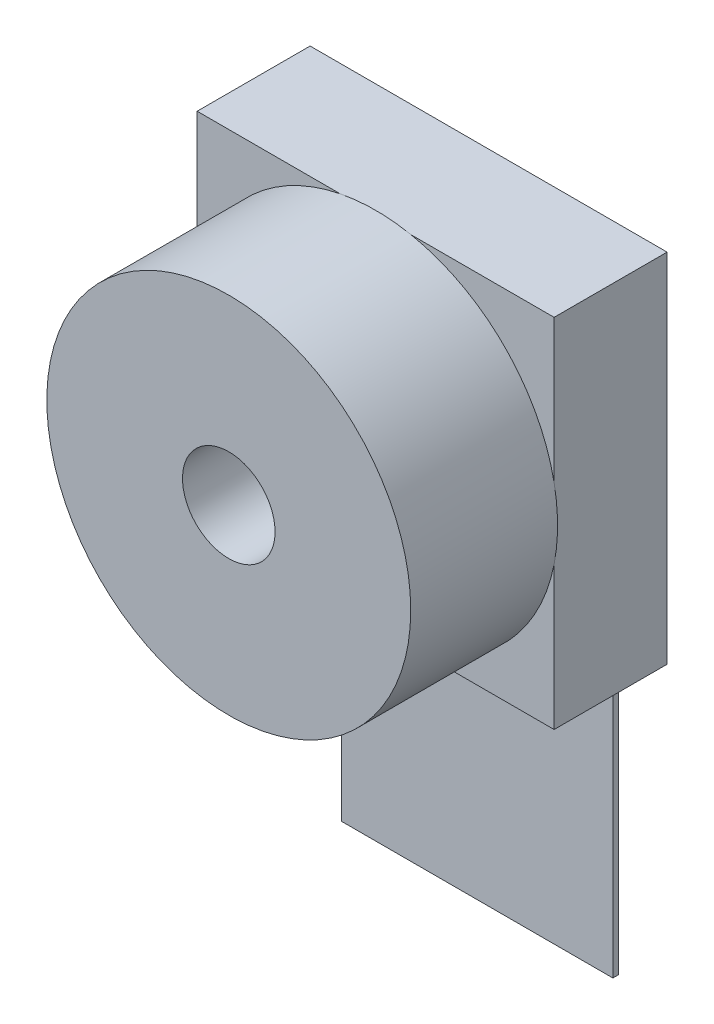
ISO-10303-21;
HEADER;
FILE_DESCRIPTION(('STEP AP214'),'2;1');
FILE_NAME('part.step','',(''),(''),'','','');
FILE_SCHEMA(('AUTOMOTIVE_DESIGN { 1 0 10303 214 1 1 1 1 }'));
ENDSEC;
DATA;
#1=APPLICATION_CONTEXT('core data for automotive mechanical design processes');
#2=APPLICATION_PROTOCOL_DEFINITION('international standard','automotive_design',2000,#1);
#3=PRODUCT_CONTEXT('',#1,'mechanical');
#4=PRODUCT('Part','Part','',(#3));
#5=PRODUCT_RELATED_PRODUCT_CATEGORY('part','',(#4));
#6=PRODUCT_DEFINITION_FORMATION('','',#4);
#7=PRODUCT_DEFINITION_CONTEXT('part definition',#1,'design');
#8=PRODUCT_DEFINITION('design','',#6,#7);
#9=PRODUCT_DEFINITION_SHAPE('','',#8);
#10=(LENGTH_UNIT() NAMED_UNIT(*) SI_UNIT(.MILLI.,.METRE.));
#11=(NAMED_UNIT(*) PLANE_ANGLE_UNIT() SI_UNIT($,.RADIAN.));
#12=(NAMED_UNIT(*) SI_UNIT($,.STERADIAN.) SOLID_ANGLE_UNIT());
#13=UNCERTAINTY_MEASURE_WITH_UNIT(LENGTH_MEASURE(1.E-05),#10,'distance_accuracy_value','');
#14=(GEOMETRIC_REPRESENTATION_CONTEXT(3) GLOBAL_UNCERTAINTY_ASSIGNED_CONTEXT((#13)) GLOBAL_UNIT_ASSIGNED_CONTEXT((#10,
#11,#12)) REPRESENTATION_CONTEXT('',''));
#15=CARTESIAN_POINT('',(0.,0.,0.));
#16=DIRECTION('',(0.,0.,1.));
#17=DIRECTION('',(1.,0.,0.));
#18=AXIS2_PLACEMENT_3D('',#15,#16,#17);
#19=CARTESIAN_POINT('',(3.048,3.048,-0.127));
#20=DIRECTION('',(-1.,0.,0.));
#21=DIRECTION('',(0.,0.,1.));
#22=AXIS2_PLACEMENT_3D('',#19,#20,#21);
#23=PLANE('',#22);
#24=DIRECTION('',(0.,0.,-1.));
#25=VECTOR('',#24,1.);
#26=CARTESIAN_POINT('',(3.048,-4.0132,-0.127));
#27=LINE('',#26,#25);
#28=CARTESIAN_POINT('',(3.048,-4.0132,0.));
#29=VERTEX_POINT('',#28);
#30=CARTESIAN_POINT('',(3.048,-4.0132,-0.127));
#31=VERTEX_POINT('',#30);
#32=EDGE_CURVE('E50',#29,#31,#27,.T.);
#33=ORIENTED_EDGE('',*,*,#32,.F.);
#34=DIRECTION('',(0.,-1.,0.));
#35=VECTOR('',#34,1.);
#36=CARTESIAN_POINT('',(3.048,3.048,0.));
#37=LINE('',#36,#35);
#38=CARTESIAN_POINT('',(3.048,-10.4775,0.));
#39=VERTEX_POINT('',#38);
#40=EDGE_CURVE('E159',#29,#39,#37,.T.);
#41=ORIENTED_EDGE('',*,*,#40,.T.);
#42=DIRECTION('',(0.,0.,1.));
#43=VECTOR('',#42,1.);
#44=CARTESIAN_POINT('',(3.048,-10.4775,-0.127));
#45=LINE('',#44,#43);
#46=CARTESIAN_POINT('',(3.048,-10.4775,-0.127));
#47=VERTEX_POINT('',#46);
#48=EDGE_CURVE('E176',#47,#39,#45,.T.);
#49=ORIENTED_EDGE('',*,*,#48,.F.);
#50=DIRECTION('',(0.,-1.,0.));
#51=VECTOR('',#50,1.);
#52=CARTESIAN_POINT('',(3.048,3.048,-0.127));
#53=LINE('',#52,#51);
#54=EDGE_CURVE('E160',#31,#47,#53,.T.);
#55=ORIENTED_EDGE('',*,*,#54,.F.);
#56=EDGE_LOOP('',(#33,#41,#49,#55));
#57=FACE_BOUND('',#56,.T.);
#58=ADVANCED_FACE('F32',(#57),#23,.F.);
#59=CARTESIAN_POINT('',(-3.048,3.048,-0.127));
#60=DIRECTION('',(1.,0.,0.));
#61=DIRECTION('',(0.,1.,0.));
#62=AXIS2_PLACEMENT_3D('',#59,#60,#61);
#63=PLANE('',#62);
#64=DIRECTION('',(0.,0.,1.));
#65=VECTOR('',#64,1.);
#66=CARTESIAN_POINT('',(-3.048,-4.0132,-0.127));
#67=LINE('',#66,#65);
#68=CARTESIAN_POINT('',(-3.048,-4.0132,-0.127));
#69=VERTEX_POINT('',#68);
#70=CARTESIAN_POINT('',(-3.048,-4.0132,0.));
#71=VERTEX_POINT('',#70);
#72=EDGE_CURVE('E156',#69,#71,#67,.T.);
#73=ORIENTED_EDGE('',*,*,#72,.F.);
#74=DIRECTION('',(0.,1.,0.));
#75=VECTOR('',#74,1.);
#76=CARTESIAN_POINT('',(-3.048,3.048,-0.127));
#77=LINE('',#76,#75);
#78=CARTESIAN_POINT('',(-3.048,-10.4775,-0.127));
#79=VERTEX_POINT('',#78);
#80=EDGE_CURVE('E165',#79,#69,#77,.T.);
#81=ORIENTED_EDGE('',*,*,#80,.F.);
#82=DIRECTION('',(0.,0.,1.));
#83=VECTOR('',#82,1.);
#84=CARTESIAN_POINT('',(-3.048,-10.4775,-0.127));
#85=LINE('',#84,#83);
#86=CARTESIAN_POINT('',(-3.048,-10.4775,0.));
#87=VERTEX_POINT('',#86);
#88=EDGE_CURVE('E168',#79,#87,#85,.T.);
#89=ORIENTED_EDGE('',*,*,#88,.T.);
#90=DIRECTION('',(0.,1.,0.));
#91=VECTOR('',#90,1.);
#92=CARTESIAN_POINT('',(-3.048,3.048,0.));
#93=LINE('',#92,#91);
#94=EDGE_CURVE('E163',#87,#71,#93,.T.);
#95=ORIENTED_EDGE('',*,*,#94,.T.);
#96=EDGE_LOOP('',(#73,#81,#89,#95));
#97=FACE_BOUND('',#96,.T.);
#98=ADVANCED_FACE('F262',(#97),#63,.F.);
#99=CARTESIAN_POINT('',(0.,0.,-0.127));
#100=DIRECTION('',(0.,0.,-1.));
#101=DIRECTION('',(-1.,0.,0.));
#102=AXIS2_PLACEMENT_3D('',#99,#100,#101);
#103=PLANE('',#102);
#104=ORIENTED_EDGE('',*,*,#80,.T.);
#105=DIRECTION('',(1.,0.,0.));
#106=VECTOR('',#105,1.);
#107=CARTESIAN_POINT('',(0.,-4.0132,-0.127));
#108=LINE('',#107,#106);
#109=EDGE_CURVE('E154',#69,#31,#108,.T.);
#110=ORIENTED_EDGE('',*,*,#109,.T.);
#111=ORIENTED_EDGE('',*,*,#54,.T.);
#112=DIRECTION('',(-1.,0.,0.));
#113=VECTOR('',#112,1.);
#114=CARTESIAN_POINT('',(3.048,-10.4775,-0.127));
#115=LINE('',#114,#113);
#116=EDGE_CURVE('E162',#47,#79,#115,.T.);
#117=ORIENTED_EDGE('',*,*,#116,.T.);
#118=EDGE_LOOP('',(#104,#110,#111,#117));
#119=FACE_BOUND('',#118,.T.);
#120=ADVANCED_FACE('F268',(#119),#103,.T.);
#121=CARTESIAN_POINT('',(0.,0.,2.286));
#122=DIRECTION('',(0.,0.,-1.));
#123=DIRECTION('',(-1.,0.,0.));
#124=AXIS2_PLACEMENT_3D('',#121,#122,#123);
#125=PLANE('',#124);
#126=CARTESIAN_POINT('',(0.,0.,2.286));
#127=DIRECTION('',(0.,0.,1.));
#128=DIRECTION('',(1.,0.,0.));
#129=AXIS2_PLACEMENT_3D('',#126,#127,#128);
#130=CIRCLE('',#129,4.09125435365183);
#131=CARTESIAN_POINT('',(4.0132,0.795353975456874,2.286));
#132=VERTEX_POINT('',#131);
#133=CARTESIAN_POINT('',(0.795353975456869,4.0132,2.286));
#134=VERTEX_POINT('',#133);
#135=EDGE_CURVE('E189',#132,#134,#130,.T.);
#136=ORIENTED_EDGE('',*,*,#135,.F.);
#137=DIRECTION('',(0.,1.,0.));
#138=VECTOR('',#137,1.);
#139=CARTESIAN_POINT('',(4.0132,-4.0132,2.286));
#140=LINE('',#139,#138);
#141=CARTESIAN_POINT('',(4.0132,4.0132,2.286));
#142=VERTEX_POINT('',#141);
#143=EDGE_CURVE('E195',#132,#142,#140,.T.);
#144=ORIENTED_EDGE('',*,*,#143,.T.);
#145=DIRECTION('',(-1.,0.,0.));
#146=VECTOR('',#145,1.);
#147=CARTESIAN_POINT('',(-4.0132,4.0132,2.286));
#148=LINE('',#147,#146);
#149=EDGE_CURVE('E196',#142,#134,#148,.T.);
#150=ORIENTED_EDGE('',*,*,#149,.T.);
#151=EDGE_LOOP('',(#136,#144,#150));
#152=FACE_BOUND('',#151,.T.);
#153=ADVANCED_FACE('F245',(#152),#125,.F.);
#154=CARTESIAN_POINT('',(-0.795353975456869,4.0132,2.286));
#155=VERTEX_POINT('',#154);
#156=CARTESIAN_POINT('',(-4.0132,0.795353975456869,2.286));
#157=VERTEX_POINT('',#156);
#158=EDGE_CURVE('E11',#155,#157,#130,.T.);
#159=ORIENTED_EDGE('',*,*,#158,.F.);
#160=CARTESIAN_POINT('',(-4.0132,4.0132,2.286));
#161=VERTEX_POINT('',#160);
#162=EDGE_CURVE('E193',#155,#161,#148,.T.);
#163=ORIENTED_EDGE('',*,*,#162,.T.);
#164=DIRECTION('',(0.,-1.,0.));
#165=VECTOR('',#164,1.);
#166=CARTESIAN_POINT('',(-4.0132,-4.0132,2.286));
#167=LINE('',#166,#165);
#168=EDGE_CURVE('E201',#161,#157,#167,.T.);
#169=ORIENTED_EDGE('',*,*,#168,.T.);
#170=EDGE_LOOP('',(#159,#163,#169));
#171=FACE_BOUND('',#170,.T.);
#172=ADVANCED_FACE('F237',(#171),#125,.F.);
#173=CARTESIAN_POINT('',(-4.0132,-0.795353975456869,2.286));
#174=VERTEX_POINT('',#173);
#175=CARTESIAN_POINT('',(-0.795353975456869,-4.0132,2.286));
#176=VERTEX_POINT('',#175);
#177=EDGE_CURVE('E41',#174,#176,#130,.T.);
#178=ORIENTED_EDGE('',*,*,#177,.F.);
#179=CARTESIAN_POINT('',(-4.0132,-4.0132,2.286));
#180=VERTEX_POINT('',#179);
#181=EDGE_CURVE('E199',#174,#180,#167,.T.);
#182=ORIENTED_EDGE('',*,*,#181,.T.);
#183=DIRECTION('',(1.,0.,0.));
#184=VECTOR('',#183,1.);
#185=CARTESIAN_POINT('',(-4.0132,-4.0132,2.286));
#186=LINE('',#185,#184);
#187=EDGE_CURVE('E134',#180,#176,#186,.T.);
#188=ORIENTED_EDGE('',*,*,#187,.T.);
#189=EDGE_LOOP('',(#178,#182,#188));
#190=FACE_BOUND('',#189,.T.);
#191=ADVANCED_FACE('F228',(#190),#125,.F.);
#192=CARTESIAN_POINT('',(0.795353975456869,-4.0132,2.286));
#193=VERTEX_POINT('',#192);
#194=CARTESIAN_POINT('',(4.0132,-0.795353975456874,2.286));
#195=VERTEX_POINT('',#194);
#196=EDGE_CURVE('E58',#193,#195,#130,.T.);
#197=ORIENTED_EDGE('',*,*,#196,.F.);
#198=CARTESIAN_POINT('',(4.0132,-4.0132,2.286));
#199=VERTEX_POINT('',#198);
#200=EDGE_CURVE('E204',#193,#199,#186,.T.);
#201=ORIENTED_EDGE('',*,*,#200,.T.);
#202=EDGE_CURVE('E131',#199,#195,#140,.T.);
#203=ORIENTED_EDGE('',*,*,#202,.T.);
#204=EDGE_LOOP('',(#197,#201,#203));
#205=FACE_BOUND('',#204,.T.);
#206=ADVANCED_FACE('F296',(#205),#125,.F.);
#207=CARTESIAN_POINT('',(4.0132,-4.0132,2.286));
#208=DIRECTION('',(-1.,0.,0.));
#209=DIRECTION('',(0.,0.,1.));
#210=AXIS2_PLACEMENT_3D('',#207,#208,#209);
#211=PLANE('',#210);
#212=DIRECTION('',(0.,0.,-1.));
#213=VECTOR('',#212,1.);
#214=CARTESIAN_POINT('',(4.0132,-4.0132,2.286));
#215=LINE('',#214,#213);
#216=CARTESIAN_POINT('',(4.0132,-4.0132,-0.254));
#217=VERTEX_POINT('',#216);
#218=EDGE_CURVE('E125',#199,#217,#215,.T.);
#219=ORIENTED_EDGE('',*,*,#218,.T.);
#220=DIRECTION('',(0.,-1.,0.));
#221=VECTOR('',#220,1.);
#222=CARTESIAN_POINT('',(4.0132,4.0132,-0.254));
#223=LINE('',#222,#221);
#224=CARTESIAN_POINT('',(4.0132,4.0132,-0.254));
#225=VERTEX_POINT('',#224);
#226=EDGE_CURVE('E129',#225,#217,#223,.T.);
#227=ORIENTED_EDGE('',*,*,#226,.F.);
#228=DIRECTION('',(0.,0.,-1.));
#229=VECTOR('',#228,1.);
#230=CARTESIAN_POINT('',(4.0132,4.0132,2.286));
#231=LINE('',#230,#229);
#232=EDGE_CURVE('E36',#142,#225,#231,.T.);
#233=ORIENTED_EDGE('',*,*,#232,.F.);
#234=ORIENTED_EDGE('',*,*,#143,.F.);
#235=EDGE_CURVE('E194',#195,#132,#140,.T.);
#236=ORIENTED_EDGE('',*,*,#235,.F.);
#237=ORIENTED_EDGE('',*,*,#202,.F.);
#238=EDGE_LOOP('',(#219,#227,#233,#234,#236,#237));
#239=FACE_BOUND('',#238,.T.);
#240=ADVANCED_FACE('F34',(#239),#211,.F.);
#241=CARTESIAN_POINT('',(-4.0132,4.0132,2.286));
#242=DIRECTION('',(0.,-1.,0.));
#243=DIRECTION('',(0.,0.,-1.));
#244=AXIS2_PLACEMENT_3D('',#241,#242,#243);
#245=PLANE('',#244);
#246=ORIENTED_EDGE('',*,*,#232,.T.);
#247=DIRECTION('',(1.,0.,0.));
#248=VECTOR('',#247,1.);
#249=CARTESIAN_POINT('',(4.0132,4.0132,-0.254));
#250=LINE('',#249,#248);
#251=CARTESIAN_POINT('',(-4.0132,4.0132,-0.254));
#252=VERTEX_POINT('',#251);
#253=EDGE_CURVE('E149',#252,#225,#250,.T.);
#254=ORIENTED_EDGE('',*,*,#253,.F.);
#255=DIRECTION('',(0.,0.,-1.));
#256=VECTOR('',#255,1.);
#257=CARTESIAN_POINT('',(-4.0132,4.0132,2.286));
#258=LINE('',#257,#256);
#259=EDGE_CURVE('E210',#161,#252,#258,.T.);
#260=ORIENTED_EDGE('',*,*,#259,.F.);
#261=ORIENTED_EDGE('',*,*,#162,.F.);
#262=EDGE_CURVE('E200',#134,#155,#148,.T.);
#263=ORIENTED_EDGE('',*,*,#262,.F.);
#264=ORIENTED_EDGE('',*,*,#149,.F.);
#265=EDGE_LOOP('',(#246,#254,#260,#261,#263,#264));
#266=FACE_BOUND('',#265,.T.);
#267=ADVANCED_FACE('F239',(#266),#245,.F.);
#268=CARTESIAN_POINT('',(-4.0132,-4.0132,2.286));
#269=DIRECTION('',(1.,0.,0.));
#270=DIRECTION('',(0.,0.,-1.));
#271=AXIS2_PLACEMENT_3D('',#268,#269,#270);
#272=PLANE('',#271);
#273=ORIENTED_EDGE('',*,*,#259,.T.);
#274=DIRECTION('',(0.,1.,0.));
#275=VECTOR('',#274,1.);
#276=CARTESIAN_POINT('',(-4.0132,4.0132,-0.254));
#277=LINE('',#276,#275);
#278=CARTESIAN_POINT('',(-4.0132,-4.0132,-0.254));
#279=VERTEX_POINT('',#278);
#280=EDGE_CURVE('E144',#279,#252,#277,.T.);
#281=ORIENTED_EDGE('',*,*,#280,.F.);
#282=DIRECTION('',(0.,0.,-1.));
#283=VECTOR('',#282,1.);
#284=CARTESIAN_POINT('',(-4.0132,-4.0132,2.286));
#285=LINE('',#284,#283);
#286=EDGE_CURVE('E133',#180,#279,#285,.T.);
#287=ORIENTED_EDGE('',*,*,#286,.F.);
#288=ORIENTED_EDGE('',*,*,#181,.F.);
#289=EDGE_CURVE('E205',#157,#174,#167,.T.);
#290=ORIENTED_EDGE('',*,*,#289,.F.);
#291=ORIENTED_EDGE('',*,*,#168,.F.);
#292=EDGE_LOOP('',(#273,#281,#287,#288,#290,#291));
#293=FACE_BOUND('',#292,.T.);
#294=ADVANCED_FACE('F230',(#293),#272,.F.);
#295=CARTESIAN_POINT('',(-4.0132,-4.0132,2.286));
#296=DIRECTION('',(0.,1.,0.));
#297=DIRECTION('',(0.,0.,1.));
#298=AXIS2_PLACEMENT_3D('',#295,#296,#297);
#299=PLANE('',#298);
#300=ORIENTED_EDGE('',*,*,#72,.T.);
#301=DIRECTION('',(1.,0.,0.));
#302=VECTOR('',#301,1.);
#303=CARTESIAN_POINT('',(-4.0132,-4.0132,0.));
#304=LINE('',#303,#302);
#305=EDGE_CURVE('E188',#71,#29,#304,.T.);
#306=ORIENTED_EDGE('',*,*,#305,.T.);
#307=ORIENTED_EDGE('',*,*,#32,.T.);
#308=ORIENTED_EDGE('',*,*,#109,.F.);
#309=EDGE_LOOP('',(#300,#306,#307,#308));
#310=FACE_BOUND('',#309,.T.);
#311=ORIENTED_EDGE('',*,*,#286,.T.);
#312=DIRECTION('',(-1.,0.,0.));
#313=VECTOR('',#312,1.);
#314=CARTESIAN_POINT('',(4.0132,-4.0132,-0.254));
#315=LINE('',#314,#313);
#316=EDGE_CURVE('E137',#217,#279,#315,.T.);
#317=ORIENTED_EDGE('',*,*,#316,.F.);
#318=ORIENTED_EDGE('',*,*,#218,.F.);
#319=ORIENTED_EDGE('',*,*,#200,.F.);
#320=EDGE_CURVE('E208',#176,#193,#186,.T.);
#321=ORIENTED_EDGE('',*,*,#320,.F.);
#322=ORIENTED_EDGE('',*,*,#187,.F.);
#323=EDGE_LOOP('',(#311,#317,#318,#319,#321,#322));
#324=FACE_BOUND('',#323,.T.);
#325=ADVANCED_FACE('F138',(#310,#324),#299,.F.);
#326=CARTESIAN_POINT('',(0.,0.,2.286));
#327=DIRECTION('',(0.,0.,1.));
#328=DIRECTION('',(1.,0.,0.));
#329=AXIS2_PLACEMENT_3D('',#326,#327,#328);
#330=PLANE('',#329);
#331=EDGE_CURVE('E183',#195,#132,#130,.T.);
#332=ORIENTED_EDGE('',*,*,#331,.F.);
#333=ORIENTED_EDGE('',*,*,#235,.T.);
#334=EDGE_LOOP('',(#332,#333));
#335=FACE_BOUND('',#334,.T.);
#336=ADVANCED_FACE('F248',(#335),#330,.F.);
#337=EDGE_CURVE('E43',#134,#155,#130,.T.);
#338=ORIENTED_EDGE('',*,*,#337,.F.);
#339=ORIENTED_EDGE('',*,*,#262,.T.);
#340=EDGE_LOOP('',(#338,#339));
#341=FACE_BOUND('',#340,.T.);
#342=ADVANCED_FACE('F241',(#341),#330,.F.);
#343=EDGE_CURVE('E225',#157,#174,#130,.T.);
#344=ORIENTED_EDGE('',*,*,#343,.F.);
#345=ORIENTED_EDGE('',*,*,#289,.T.);
#346=EDGE_LOOP('',(#344,#345));
#347=FACE_BOUND('',#346,.T.);
#348=ADVANCED_FACE('F232',(#347),#330,.F.);
#349=EDGE_CURVE('E223',#176,#193,#130,.T.);
#350=ORIENTED_EDGE('',*,*,#349,.F.);
#351=ORIENTED_EDGE('',*,*,#320,.T.);
#352=EDGE_LOOP('',(#350,#351));
#353=FACE_BOUND('',#352,.T.);
#354=ADVANCED_FACE('F251',(#353),#330,.F.);
#355=CARTESIAN_POINT('',(0.,0.,5.588));
#356=DIRECTION('',(0.,0.,-1.));
#357=DIRECTION('',(-1.,0.,0.));
#358=AXIS2_PLACEMENT_3D('',#355,#356,#357);
#359=CYLINDRICAL_SURFACE('',#358,4.09125435365183);
#360=CARTESIAN_POINT('',(0.,0.,5.588));
#361=DIRECTION('',(0.,0.,1.));
#362=DIRECTION('',(1.,0.,0.));
#363=AXIS2_PLACEMENT_3D('',#360,#361,#362);
#364=CIRCLE('',#363,4.09125435365183);
#365=CARTESIAN_POINT('',(4.09125435365183,0.,5.588));
#366=VERTEX_POINT('',#365);
#367=EDGE_CURVE('E186',#366,#366,#364,.T.);
#368=ORIENTED_EDGE('',*,*,#367,.F.);
#369=EDGE_LOOP('',(#368));
#370=FACE_BOUND('',#369,.T.);
#371=ORIENTED_EDGE('',*,*,#135,.T.);
#372=ORIENTED_EDGE('',*,*,#337,.T.);
#373=ORIENTED_EDGE('',*,*,#158,.T.);
#374=ORIENTED_EDGE('',*,*,#343,.T.);
#375=ORIENTED_EDGE('',*,*,#177,.T.);
#376=ORIENTED_EDGE('',*,*,#349,.T.);
#377=ORIENTED_EDGE('',*,*,#196,.T.);
#378=ORIENTED_EDGE('',*,*,#331,.T.);
#379=EDGE_LOOP('',(#371,#372,#373,#374,#375,#376,#377,#378));
#380=FACE_BOUND('',#379,.T.);
#381=ADVANCED_FACE('F221',(#370,#380),#359,.T.);
#382=CARTESIAN_POINT('',(0.,0.,5.588));
#383=DIRECTION('',(0.,0.,1.));
#384=DIRECTION('',(1.,0.,0.));
#385=AXIS2_PLACEMENT_3D('',#382,#383,#384);
#386=PLANE('',#385);
#387=CARTESIAN_POINT('',(0.,0.,5.588));
#388=DIRECTION('',(0.,0.,1.));
#389=DIRECTION('',(1.,0.,0.));
#390=AXIS2_PLACEMENT_3D('',#387,#388,#389);
#391=CIRCLE('',#390,1.04049465097927);
#392=CARTESIAN_POINT('',(1.04049465097927,0.,5.588));
#393=VERTEX_POINT('',#392);
#394=EDGE_CURVE('E179',#393,#393,#391,.T.);
#395=ORIENTED_EDGE('',*,*,#394,.F.);
#396=EDGE_LOOP('',(#395));
#397=FACE_BOUND('',#396,.T.);
#398=ORIENTED_EDGE('',*,*,#367,.T.);
#399=EDGE_LOOP('',(#398));
#400=FACE_BOUND('',#399,.T.);
#401=ADVANCED_FACE('F280',(#397,#400),#386,.T.);
#402=CARTESIAN_POINT('',(0.,0.,2.286));
#403=DIRECTION('',(0.,0.,1.));
#404=DIRECTION('',(1.,0.,0.));
#405=AXIS2_PLACEMENT_3D('',#402,#403,#404);
#406=CYLINDRICAL_SURFACE('',#405,1.04049465097927);
#407=CARTESIAN_POINT('',(0.,0.,2.286));
#408=DIRECTION('',(0.,0.,1.));
#409=DIRECTION('',(1.,0.,0.));
#410=AXIS2_PLACEMENT_3D('',#407,#408,#409);
#411=CIRCLE('',#410,1.04049465097927);
#412=CARTESIAN_POINT('',(1.04049465097927,0.,2.286));
#413=VERTEX_POINT('',#412);
#414=EDGE_CURVE('E180',#413,#413,#411,.T.);
#415=CARTESIAN_POINT('',(1.04049465097927,0.,2.286));
#416=CARTESIAN_POINT('',(1.04049465097927,0.,2.32039583333333));
#417=CARTESIAN_POINT('',(1.04049465097927,0.,2.35479166666667));
#418=CARTESIAN_POINT('',(1.04049465097927,0.,2.42358333333333));
#419=CARTESIAN_POINT('',(1.04049465097927,0.,2.45797916666667));
#420=CARTESIAN_POINT('',(1.04049465097927,0.,2.52677083333333));
#421=CARTESIAN_POINT('',(1.04049465097927,0.,2.56116666666667));
#422=CARTESIAN_POINT('',(1.04049465097927,0.,2.62995833333333));
#423=CARTESIAN_POINT('',(1.04049465097927,0.,2.66435416666667));
#424=CARTESIAN_POINT('',(1.04049465097927,0.,2.73314583333333));
#425=CARTESIAN_POINT('',(1.04049465097927,0.,2.76754166666667));
#426=CARTESIAN_POINT('',(1.04049465097927,0.,2.83633333333333));
#427=CARTESIAN_POINT('',(1.04049465097927,0.,2.87072916666667));
#428=CARTESIAN_POINT('',(1.04049465097927,0.,2.93952083333333));
#429=CARTESIAN_POINT('',(1.04049465097927,0.,2.97391666666667));
#430=CARTESIAN_POINT('',(1.04049465097927,0.,3.04270833333333));
#431=CARTESIAN_POINT('',(1.04049465097927,0.,3.07710416666667));
#432=CARTESIAN_POINT('',(1.04049465097927,0.,3.14589583333333));
#433=CARTESIAN_POINT('',(1.04049465097927,0.,3.18029166666667));
#434=CARTESIAN_POINT('',(1.04049465097927,0.,3.24908333333333));
#435=CARTESIAN_POINT('',(1.04049465097927,0.,3.28347916666667));
#436=CARTESIAN_POINT('',(1.04049465097927,0.,3.35227083333333));
#437=CARTESIAN_POINT('',(1.04049465097927,0.,3.38666666666667));
#438=CARTESIAN_POINT('',(1.04049465097927,0.,3.45545833333333));
#439=CARTESIAN_POINT('',(1.04049465097927,0.,3.48985416666667));
#440=CARTESIAN_POINT('',(1.04049465097927,0.,3.55864583333333));
#441=CARTESIAN_POINT('',(1.04049465097927,0.,3.59304166666667));
#442=CARTESIAN_POINT('',(1.04049465097927,0.,3.66183333333333));
#443=CARTESIAN_POINT('',(1.04049465097927,0.,3.69622916666667));
#444=CARTESIAN_POINT('',(1.04049465097927,0.,3.76502083333333));
#445=CARTESIAN_POINT('',(1.04049465097927,0.,3.79941666666667));
#446=CARTESIAN_POINT('',(1.04049465097927,0.,3.86820833333333));
#447=CARTESIAN_POINT('',(1.04049465097927,0.,3.90260416666667));
#448=CARTESIAN_POINT('',(1.04049465097927,0.,3.97139583333333));
#449=CARTESIAN_POINT('',(1.04049465097927,0.,4.00579166666667));
#450=CARTESIAN_POINT('',(1.04049465097927,0.,4.07458333333333));
#451=CARTESIAN_POINT('',(1.04049465097927,0.,4.10897916666667));
#452=CARTESIAN_POINT('',(1.04049465097927,0.,4.17777083333333));
#453=CARTESIAN_POINT('',(1.04049465097927,0.,4.21216666666666));
#454=CARTESIAN_POINT('',(1.04049465097927,0.,4.28095833333333));
#455=CARTESIAN_POINT('',(1.04049465097927,0.,4.31535416666667));
#456=CARTESIAN_POINT('',(1.04049465097927,0.,4.38414583333333));
#457=CARTESIAN_POINT('',(1.04049465097927,0.,4.41854166666667));
#458=CARTESIAN_POINT('',(1.04049465097927,0.,4.48733333333333));
#459=CARTESIAN_POINT('',(1.04049465097927,0.,4.52172916666667));
#460=CARTESIAN_POINT('',(1.04049465097927,0.,4.59052083333333));
#461=CARTESIAN_POINT('',(1.04049465097927,0.,4.62491666666666));
#462=CARTESIAN_POINT('',(1.04049465097927,0.,4.69370833333333));
#463=CARTESIAN_POINT('',(1.04049465097927,0.,4.72810416666667));
#464=CARTESIAN_POINT('',(1.04049465097927,0.,4.79689583333333));
#465=CARTESIAN_POINT('',(1.04049465097927,0.,4.83129166666667));
#466=CARTESIAN_POINT('',(1.04049465097927,0.,4.90008333333333));
#467=CARTESIAN_POINT('',(1.04049465097927,0.,4.93447916666666));
#468=CARTESIAN_POINT('',(1.04049465097927,0.,5.00327083333333));
#469=CARTESIAN_POINT('',(1.04049465097927,0.,5.03766666666666));
#470=CARTESIAN_POINT('',(1.04049465097927,0.,5.10645833333333));
#471=CARTESIAN_POINT('',(1.04049465097927,0.,5.14085416666667));
#472=CARTESIAN_POINT('',(1.04049465097927,0.,5.20964583333333));
#473=CARTESIAN_POINT('',(1.04049465097927,0.,5.24404166666667));
#474=CARTESIAN_POINT('',(1.04049465097927,0.,5.31283333333333));
#475=CARTESIAN_POINT('',(1.04049465097927,0.,5.34722916666666));
#476=CARTESIAN_POINT('',(1.04049465097927,0.,5.41602083333333));
#477=CARTESIAN_POINT('',(1.04049465097927,0.,5.45041666666666));
#478=CARTESIAN_POINT('',(1.04049465097927,0.,5.51920833333333));
#479=CARTESIAN_POINT('',(1.04049465097927,0.,5.55360416666667));
#480=CARTESIAN_POINT('',(1.04049465097927,0.,5.588));
#481=B_SPLINE_CURVE_WITH_KNOTS('',3,(#415,#416,#417,#418,#419,#420,#421,#422,#423,#424,#425,
#426,#427,#428,#429,#430,#431,#432,#433,#434,#435,#436,#437,#438,#439,#440,#441,#442,#443,#444,
#445,#446,#447,#448,#449,#450,#451,#452,#453,#454,#455,#456,#457,#458,#459,#460,#461,#462,#463,
#464,#465,#466,#467,#468,#469,#470,#471,#472,#473,#474,#475,#476,#477,#478,#479,#480),
.UNSPECIFIED.,.F.,.F.,(4,2,2,2,2,2,2,2,2,2,2,2,2,2,2,2,2,2,2,2,2,2,2,2,2,2,2,2,2,2,2,2,4),(0.,
0.1031875,0.206375,0.3095625,0.41275,0.5159375,0.619125,0.7223125,0.8255,0.9286875,1.031875,
1.1350625,1.23825,1.3414375,1.444625,1.5478125,1.651,1.7541875,1.857375,1.9605625,2.06375,
2.1669375,2.270125,2.3733125,2.4765,2.5796875,2.682875,2.7860625,2.88925,2.9924375,3.095625,
3.1988125,3.302),.UNSPECIFIED.);
#482=EDGE_CURVE('BSEAM277',#413,#393,#481,.T.);
#483=ORIENTED_EDGE('',*,*,#414,.F.);
#484=ORIENTED_EDGE('',*,*,#394,.T.);
#485=ORIENTED_EDGE('',*,*,#482,.T.);
#486=ORIENTED_EDGE('',*,*,#482,.F.);
#487=EDGE_LOOP('',(#483,#485,#484,#486));
#488=FACE_BOUND('',#487,.T.);
#489=ADVANCED_FACE('F277',(#488),#406,.F.);
#490=CARTESIAN_POINT('',(0.,0.,2.286));
#491=DIRECTION('',(0.,0.,1.));
#492=DIRECTION('',(1.,0.,0.));
#493=AXIS2_PLACEMENT_3D('',#490,#491,#492);
#494=PLANE('',#493);
#495=ORIENTED_EDGE('',*,*,#414,.T.);
#496=EDGE_LOOP('',(#495));
#497=FACE_BOUND('',#496,.T.);
#498=ADVANCED_FACE('F274',(#497),#494,.T.);
#499=CARTESIAN_POINT('',(3.048,-10.4775,-0.127));
#500=DIRECTION('',(0.,1.,0.));
#501=DIRECTION('',(0.,0.,1.));
#502=AXIS2_PLACEMENT_3D('',#499,#500,#501);
#503=PLANE('',#502);
#504=DIRECTION('',(-1.,0.,0.));
#505=VECTOR('',#504,1.);
#506=CARTESIAN_POINT('',(3.048,-10.4775,0.));
#507=LINE('',#506,#505);
#508=EDGE_CURVE('E170',#39,#87,#507,.T.);
#509=ORIENTED_EDGE('',*,*,#508,.T.);
#510=ORIENTED_EDGE('',*,*,#88,.F.);
#511=ORIENTED_EDGE('',*,*,#116,.F.);
#512=ORIENTED_EDGE('',*,*,#48,.T.);
#513=EDGE_LOOP('',(#509,#510,#511,#512));
#514=FACE_BOUND('',#513,.T.);
#515=ADVANCED_FACE('F273',(#514),#503,.F.);
#516=CARTESIAN_POINT('',(0.,0.,0.));
#517=DIRECTION('',(0.,0.,-1.));
#518=DIRECTION('',(-1.,0.,0.));
#519=AXIS2_PLACEMENT_3D('',#516,#517,#518);
#520=PLANE('',#519);
#521=ORIENTED_EDGE('',*,*,#305,.F.);
#522=ORIENTED_EDGE('',*,*,#94,.F.);
#523=ORIENTED_EDGE('',*,*,#508,.F.);
#524=ORIENTED_EDGE('',*,*,#40,.F.);
#525=EDGE_LOOP('',(#521,#522,#523,#524));
#526=FACE_BOUND('',#525,.T.);
#527=ADVANCED_FACE('F343',(#526),#520,.F.);
#528=CARTESIAN_POINT('',(0.,0.,-0.254));
#529=DIRECTION('',(0.,0.,-1.));
#530=DIRECTION('',(-1.,0.,0.));
#531=AXIS2_PLACEMENT_3D('',#528,#529,#530);
#532=PLANE('',#531);
#533=ORIENTED_EDGE('',*,*,#226,.T.);
#534=ORIENTED_EDGE('',*,*,#316,.T.);
#535=ORIENTED_EDGE('',*,*,#280,.T.);
#536=ORIENTED_EDGE('',*,*,#253,.T.);
#537=EDGE_LOOP('',(#533,#534,#535,#536));
#538=FACE_BOUND('',#537,.T.);
#539=ADVANCED_FACE('F147',(#538),#532,.T.);
#540=CLOSED_SHELL('',(#58,#98,#120,#153,#172,#191,#206,#240,#267,#294,#325,#336,#342,#348,#354,
#381,#401,#489,#498,#515,#527,#539));
#541=MANIFOLD_SOLID_BREP('B2',#540);
#542=ADVANCED_BREP_SHAPE_REPRESENTATION('',(#18,#541),#14);
#543=SHAPE_DEFINITION_REPRESENTATION(#9,#542);
ENDSEC;
END-ISO-10303-21;
